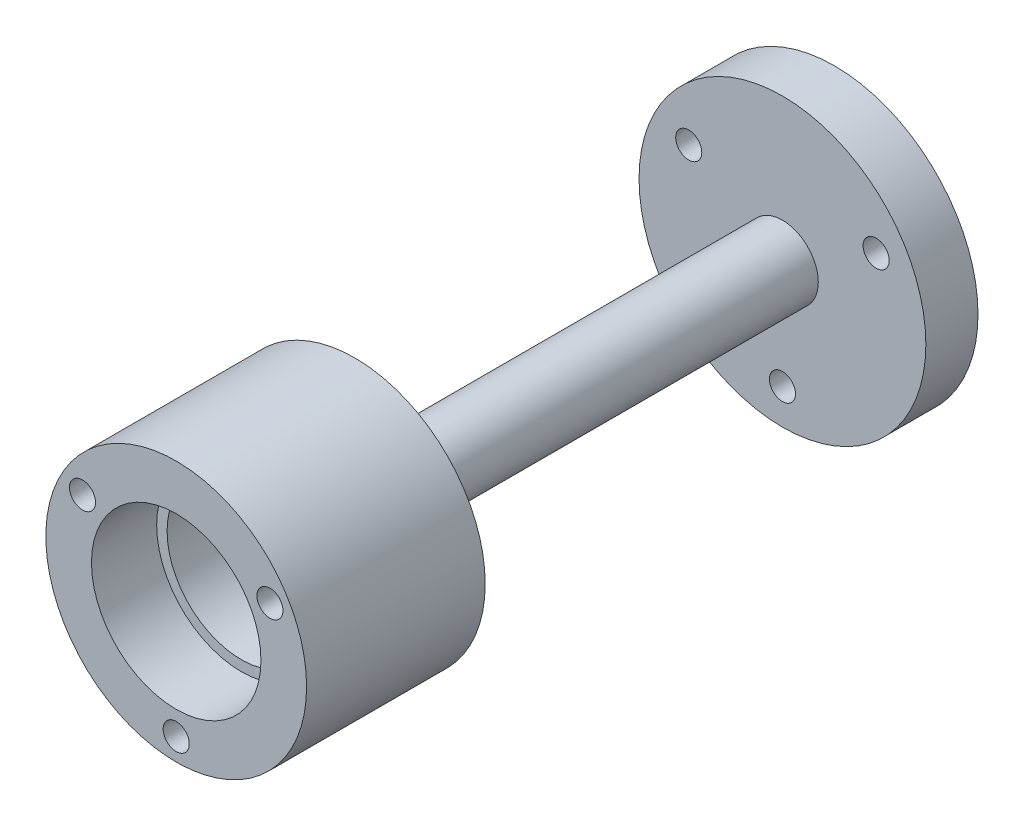
ISO-10303-21;
HEADER;
FILE_DESCRIPTION(('STEP AP214'),'2;1');
FILE_NAME('part.step','',(''),(''),'','','');
FILE_SCHEMA(('AUTOMOTIVE_DESIGN { 1 0 10303 214 1 1 1 1 }'));
ENDSEC;
DATA;
#1=APPLICATION_CONTEXT('core data for automotive mechanical design processes');
#2=APPLICATION_PROTOCOL_DEFINITION('international standard','automotive_design',2000,#1);
#3=PRODUCT_CONTEXT('',#1,'mechanical');
#4=PRODUCT('Part','Part','',(#3));
#5=PRODUCT_RELATED_PRODUCT_CATEGORY('part','',(#4));
#6=PRODUCT_DEFINITION_FORMATION('','',#4);
#7=PRODUCT_DEFINITION_CONTEXT('part definition',#1,'design');
#8=PRODUCT_DEFINITION('design','',#6,#7);
#9=PRODUCT_DEFINITION_SHAPE('','',#8);
#10=(LENGTH_UNIT() NAMED_UNIT(*) SI_UNIT(.MILLI.,.METRE.));
#11=(NAMED_UNIT(*) PLANE_ANGLE_UNIT() SI_UNIT($,.RADIAN.));
#12=(NAMED_UNIT(*) SI_UNIT($,.STERADIAN.) SOLID_ANGLE_UNIT());
#13=UNCERTAINTY_MEASURE_WITH_UNIT(LENGTH_MEASURE(1.E-05),#10,'distance_accuracy_value','');
#14=(GEOMETRIC_REPRESENTATION_CONTEXT(3) GLOBAL_UNCERTAINTY_ASSIGNED_CONTEXT((#13)) GLOBAL_UNIT_ASSIGNED_CONTEXT((#10,
#11,#12)) REPRESENTATION_CONTEXT('',''));
#15=CARTESIAN_POINT('',(0.,0.,0.));
#16=DIRECTION('',(0.,0.,1.));
#17=DIRECTION('',(1.,0.,0.));
#18=AXIS2_PLACEMENT_3D('',#15,#16,#17);
#19=CARTESIAN_POINT('',(0.,0.,32.81));
#20=DIRECTION('',(0.,0.,-1.));
#21=DIRECTION('',(-1.,0.,0.));
#22=AXIS2_PLACEMENT_3D('',#19,#20,#21);
#23=CYLINDRICAL_SURFACE('',#22,2.75);
#24=CARTESIAN_POINT('',(0.,0.,0.));
#25=DIRECTION('',(0.,0.,1.));
#26=DIRECTION('',(1.,0.,0.));
#27=AXIS2_PLACEMENT_3D('',#24,#25,#26);
#28=CIRCLE('',#27,2.75);
#29=CARTESIAN_POINT('',(2.75,0.,0.));
#30=VERTEX_POINT('',#29);
#31=EDGE_CURVE('E50',#30,#30,#28,.T.);
#32=ORIENTED_EDGE('',*,*,#31,.T.);
#33=EDGE_LOOP('',(#32));
#34=FACE_BOUND('',#33,.T.);
#35=CARTESIAN_POINT('',(0.,0.,32.8));
#36=DIRECTION('',(0.,0.,1.));
#37=DIRECTION('',(1.,0.,0.));
#38=AXIS2_PLACEMENT_3D('',#35,#36,#37);
#39=CIRCLE('',#38,2.75);
#40=CARTESIAN_POINT('',(2.75,0.,32.8));
#41=VERTEX_POINT('',#40);
#42=EDGE_CURVE('E10',#41,#41,#39,.T.);
#43=ORIENTED_EDGE('',*,*,#42,.F.);
#44=EDGE_LOOP('',(#43));
#45=FACE_BOUND('',#44,.T.);
#46=ADVANCED_FACE('F39',(#34,#45),#23,.T.);
#47=CARTESIAN_POINT('',(0.,0.,0.));
#48=DIRECTION('',(0.,0.,-1.));
#49=DIRECTION('',(-1.,0.,0.));
#50=AXIS2_PLACEMENT_3D('',#47,#48,#49);
#51=CYLINDRICAL_SURFACE('',#50,11.);
#52=CARTESIAN_POINT('',(0.,0.,0.));
#53=DIRECTION('',(0.,0.,1.));
#54=DIRECTION('',(1.,0.,0.));
#55=AXIS2_PLACEMENT_3D('',#52,#53,#54);
#56=CIRCLE('',#55,11.);
#57=CARTESIAN_POINT('',(11.,0.,0.));
#58=VERTEX_POINT('',#57);
#59=EDGE_CURVE('E52',#58,#58,#56,.T.);
#60=ORIENTED_EDGE('',*,*,#59,.F.);
#61=EDGE_LOOP('',(#60));
#62=FACE_BOUND('',#61,.T.);
#63=CARTESIAN_POINT('',(0.,0.,-4.));
#64=DIRECTION('',(0.,0.,1.));
#65=DIRECTION('',(1.,0.,0.));
#66=AXIS2_PLACEMENT_3D('',#63,#64,#65);
#67=CIRCLE('',#66,11.);
#68=CARTESIAN_POINT('',(11.,0.,-4.));
#69=VERTEX_POINT('',#68);
#70=EDGE_CURVE('E58',#69,#69,#67,.T.);
#71=ORIENTED_EDGE('',*,*,#70,.T.);
#72=EDGE_LOOP('',(#71));
#73=FACE_BOUND('',#72,.T.);
#74=ADVANCED_FACE('F41',(#62,#73),#51,.T.);
#75=CARTESIAN_POINT('',(0.,0.,0.));
#76=DIRECTION('',(0.,0.,1.));
#77=DIRECTION('',(1.,0.,0.));
#78=AXIS2_PLACEMENT_3D('',#75,#76,#77);
#79=PLANE('',#78);
#80=CARTESIAN_POINT('',(7.18801085141084,4.15,0.));
#81=DIRECTION('',(0.,0.,1.));
#82=DIRECTION('',(1.,0.,0.));
#83=AXIS2_PLACEMENT_3D('',#80,#81,#82);
#84=CIRCLE('',#83,1.);
#85=CARTESIAN_POINT('',(8.18801085141084,4.15,0.));
#86=VERTEX_POINT('',#85);
#87=EDGE_CURVE('E91',#86,#86,#84,.T.);
#88=ORIENTED_EDGE('',*,*,#87,.F.);
#89=EDGE_LOOP('',(#88));
#90=FACE_BOUND('',#89,.T.);
#91=CARTESIAN_POINT('',(-7.18801085141084,4.15,0.));
#92=DIRECTION('',(0.,0.,1.));
#93=DIRECTION('',(1.,0.,0.));
#94=AXIS2_PLACEMENT_3D('',#91,#92,#93);
#95=CIRCLE('',#94,1.);
#96=CARTESIAN_POINT('',(-6.18801085141084,4.15,0.));
#97=VERTEX_POINT('',#96);
#98=EDGE_CURVE('E105',#97,#97,#95,.T.);
#99=ORIENTED_EDGE('',*,*,#98,.F.);
#100=EDGE_LOOP('',(#99));
#101=FACE_BOUND('',#100,.T.);
#102=CARTESIAN_POINT('',(0.,-8.3,0.));
#103=DIRECTION('',(0.,0.,1.));
#104=DIRECTION('',(1.,0.,0.));
#105=AXIS2_PLACEMENT_3D('',#102,#103,#104);
#106=CIRCLE('',#105,1.);
#107=CARTESIAN_POINT('',(0.999999999999999,-8.3,0.));
#108=VERTEX_POINT('',#107);
#109=EDGE_CURVE('E106',#108,#108,#106,.T.);
#110=ORIENTED_EDGE('',*,*,#109,.F.);
#111=EDGE_LOOP('',(#110));
#112=FACE_BOUND('',#111,.T.);
#113=ORIENTED_EDGE('',*,*,#31,.F.);
#114=EDGE_LOOP('',(#113));
#115=FACE_BOUND('',#114,.T.);
#116=ORIENTED_EDGE('',*,*,#59,.T.);
#117=EDGE_LOOP('',(#116));
#118=FACE_BOUND('',#117,.T.);
#119=ADVANCED_FACE('F197',(#90,#101,#112,#115,#118),#79,.T.);
#120=CARTESIAN_POINT('',(0.,0.,-4.));
#121=DIRECTION('',(0.,0.,1.));
#122=DIRECTION('',(1.,0.,0.));
#123=AXIS2_PLACEMENT_3D('',#120,#121,#122);
#124=PLANE('',#123);
#125=CARTESIAN_POINT('',(7.18801085141084,4.15,-4.));
#126=DIRECTION('',(0.,0.,-1.));
#127=DIRECTION('',(-1.,0.,0.));
#128=AXIS2_PLACEMENT_3D('',#125,#126,#127);
#129=CIRCLE('',#128,1.);
#130=CARTESIAN_POINT('',(6.18801085141084,4.15,-4.));
#131=VERTEX_POINT('',#130);
#132=EDGE_CURVE('E109',#131,#131,#129,.T.);
#133=ORIENTED_EDGE('',*,*,#132,.F.);
#134=EDGE_LOOP('',(#133));
#135=FACE_BOUND('',#134,.T.);
#136=CARTESIAN_POINT('',(-7.18801085141084,4.15,-4.));
#137=DIRECTION('',(0.,0.,-1.));
#138=DIRECTION('',(-1.,0.,0.));
#139=AXIS2_PLACEMENT_3D('',#136,#137,#138);
#140=CIRCLE('',#139,1.);
#141=CARTESIAN_POINT('',(-8.18801085141084,4.15,-4.));
#142=VERTEX_POINT('',#141);
#143=EDGE_CURVE('E114',#142,#142,#140,.T.);
#144=ORIENTED_EDGE('',*,*,#143,.F.);
#145=EDGE_LOOP('',(#144));
#146=FACE_BOUND('',#145,.T.);
#147=CARTESIAN_POINT('',(0.,-8.3,-4.));
#148=DIRECTION('',(0.,0.,-1.));
#149=DIRECTION('',(-1.,0.,0.));
#150=AXIS2_PLACEMENT_3D('',#147,#148,#149);
#151=CIRCLE('',#150,1.);
#152=CARTESIAN_POINT('',(-1.,-8.3,-4.));
#153=VERTEX_POINT('',#152);
#154=EDGE_CURVE('E111',#153,#153,#151,.T.);
#155=ORIENTED_EDGE('',*,*,#154,.F.);
#156=EDGE_LOOP('',(#155));
#157=FACE_BOUND('',#156,.T.);
#158=ORIENTED_EDGE('',*,*,#70,.F.);
#159=EDGE_LOOP('',(#158));
#160=FACE_BOUND('',#159,.T.);
#161=ADVANCED_FACE('F207',(#135,#146,#157,#160),#124,.F.);
#162=CARTESIAN_POINT('',(0.,0.,35.));
#163=DIRECTION('',(0.,0.,-1.));
#164=DIRECTION('',(-1.,0.,0.));
#165=AXIS2_PLACEMENT_3D('',#162,#163,#164);
#166=CYLINDRICAL_SURFACE('',#165,10.);
#167=CARTESIAN_POINT('',(0.,0.,32.8));
#168=DIRECTION('',(0.,0.,1.));
#169=DIRECTION('',(1.,0.,0.));
#170=AXIS2_PLACEMENT_3D('',#167,#168,#169);
#171=CIRCLE('',#170,10.);
#172=CARTESIAN_POINT('',(10.,0.,32.8));
#173=VERTEX_POINT('',#172);
#174=EDGE_CURVE('E65',#173,#173,#171,.T.);
#175=ORIENTED_EDGE('',*,*,#174,.T.);
#176=EDGE_LOOP('',(#175));
#177=FACE_BOUND('',#176,.T.);
#178=CARTESIAN_POINT('',(0.,0.,46.5));
#179=DIRECTION('',(0.,0.,1.));
#180=DIRECTION('',(1.,0.,0.));
#181=AXIS2_PLACEMENT_3D('',#178,#179,#180);
#182=CIRCLE('',#181,10.);
#183=CARTESIAN_POINT('',(10.,0.,46.5));
#184=VERTEX_POINT('',#183);
#185=EDGE_CURVE('E82',#184,#184,#182,.T.);
#186=ORIENTED_EDGE('',*,*,#185,.F.);
#187=EDGE_LOOP('',(#186));
#188=FACE_BOUND('',#187,.T.);
#189=ADVANCED_FACE('F204',(#177,#188),#166,.T.);
#190=CARTESIAN_POINT('',(0.,0.,32.8));
#191=DIRECTION('',(0.,0.,1.));
#192=DIRECTION('',(1.,0.,0.));
#193=AXIS2_PLACEMENT_3D('',#190,#191,#192);
#194=PLANE('',#193);
#195=ORIENTED_EDGE('',*,*,#42,.T.);
#196=EDGE_LOOP('',(#195));
#197=FACE_BOUND('',#196,.T.);
#198=ORIENTED_EDGE('',*,*,#174,.F.);
#199=EDGE_LOOP('',(#198));
#200=FACE_BOUND('',#199,.T.);
#201=ADVANCED_FACE('F163',(#197,#200),#194,.F.);
#202=CARTESIAN_POINT('',(0.,0.,46.5));
#203=DIRECTION('',(0.,0.,1.));
#204=DIRECTION('',(1.,0.,0.));
#205=AXIS2_PLACEMENT_3D('',#202,#203,#204);
#206=PLANE('',#205);
#207=CARTESIAN_POINT('',(7.18801085141084,4.15,46.5));
#208=DIRECTION('',(0.,0.,1.));
#209=DIRECTION('',(1.,0.,0.));
#210=AXIS2_PLACEMENT_3D('',#207,#208,#209);
#211=CIRCLE('',#210,1.);
#212=CARTESIAN_POINT('',(8.18801085141084,4.15,46.5));
#213=VERTEX_POINT('',#212);
#214=EDGE_CURVE('E139',#213,#213,#211,.T.);
#215=ORIENTED_EDGE('',*,*,#214,.F.);
#216=EDGE_LOOP('',(#215));
#217=FACE_BOUND('',#216,.T.);
#218=CARTESIAN_POINT('',(-7.18801085141084,4.15,46.5));
#219=DIRECTION('',(0.,0.,1.));
#220=DIRECTION('',(1.,0.,0.));
#221=AXIS2_PLACEMENT_3D('',#218,#219,#220);
#222=CIRCLE('',#221,1.);
#223=CARTESIAN_POINT('',(-6.18801085141084,4.15,46.5));
#224=VERTEX_POINT('',#223);
#225=EDGE_CURVE('E134',#224,#224,#222,.T.);
#226=ORIENTED_EDGE('',*,*,#225,.F.);
#227=EDGE_LOOP('',(#226));
#228=FACE_BOUND('',#227,.T.);
#229=CARTESIAN_POINT('',(0.,-8.3,46.5));
#230=DIRECTION('',(0.,0.,1.));
#231=DIRECTION('',(1.,0.,0.));
#232=AXIS2_PLACEMENT_3D('',#229,#230,#231);
#233=CIRCLE('',#232,1.);
#234=CARTESIAN_POINT('',(0.999999999999999,-8.3,46.5));
#235=VERTEX_POINT('',#234);
#236=EDGE_CURVE('E126',#235,#235,#233,.T.);
#237=ORIENTED_EDGE('',*,*,#236,.F.);
#238=EDGE_LOOP('',(#237));
#239=FACE_BOUND('',#238,.T.);
#240=ORIENTED_EDGE('',*,*,#185,.T.);
#241=EDGE_LOOP('',(#240));
#242=FACE_BOUND('',#241,.T.);
#243=CARTESIAN_POINT('',(0.,0.,46.5));
#244=DIRECTION('',(0.,0.,1.));
#245=DIRECTION('',(1.,0.,0.));
#246=AXIS2_PLACEMENT_3D('',#243,#244,#245);
#247=CIRCLE('',#246,6.5);
#248=CARTESIAN_POINT('',(6.5,0.,46.5));
#249=VERTEX_POINT('',#248);
#250=EDGE_CURVE('E89',#249,#249,#247,.T.);
#251=ORIENTED_EDGE('',*,*,#250,.F.);
#252=EDGE_LOOP('',(#251));
#253=FACE_BOUND('',#252,.T.);
#254=ADVANCED_FACE('F160',(#217,#228,#239,#242,#253),#206,.T.);
#255=CARTESIAN_POINT('',(0.,0.,46.5));
#256=DIRECTION('',(0.,0.,-1.));
#257=DIRECTION('',(-1.,0.,0.));
#258=AXIS2_PLACEMENT_3D('',#255,#256,#257);
#259=CYLINDRICAL_SURFACE('',#258,6.5);
#260=ORIENTED_EDGE('',*,*,#250,.T.);
#261=EDGE_LOOP('',(#260));
#262=FACE_BOUND('',#261,.T.);
#263=CARTESIAN_POINT('',(0.,0.,41.5));
#264=DIRECTION('',(0.,0.,1.));
#265=DIRECTION('',(1.,0.,0.));
#266=AXIS2_PLACEMENT_3D('',#263,#264,#265);
#267=CIRCLE('',#266,6.5);
#268=CARTESIAN_POINT('',(6.5,0.,41.5));
#269=VERTEX_POINT('',#268);
#270=EDGE_CURVE('E92',#269,#269,#267,.T.);
#271=ORIENTED_EDGE('',*,*,#270,.F.);
#272=EDGE_LOOP('',(#271));
#273=FACE_BOUND('',#272,.T.);
#274=ADVANCED_FACE('F156',(#262,#273),#259,.F.);
#275=CARTESIAN_POINT('',(0.,0.,35.));
#276=DIRECTION('',(0.,0.,1.));
#277=DIRECTION('',(1.,0.,0.));
#278=AXIS2_PLACEMENT_3D('',#275,#276,#277);
#279=PLANE('',#278);
#280=CARTESIAN_POINT('',(0.,0.,35.));
#281=DIRECTION('',(0.,0.,1.));
#282=DIRECTION('',(1.,0.,0.));
#283=AXIS2_PLACEMENT_3D('',#280,#281,#282);
#284=CIRCLE('',#283,5.7);
#285=CARTESIAN_POINT('',(-5.7,0.,35.));
#286=VERTEX_POINT('',#285);
#287=EDGE_CURVE('E76',#286,#286,#284,.T.);
#288=ORIENTED_EDGE('',*,*,#287,.T.);
#289=EDGE_LOOP('',(#288));
#290=FACE_BOUND('',#289,.T.);
#291=ADVANCED_FACE('F173',(#290),#279,.T.);
#292=CARTESIAN_POINT('',(0.,0.,41.5));
#293=DIRECTION('',(0.,0.,-1.));
#294=DIRECTION('',(-1.,0.,0.));
#295=AXIS2_PLACEMENT_3D('',#292,#293,#294);
#296=CYLINDRICAL_SURFACE('',#295,5.7);
#297=CARTESIAN_POINT('',(0.,0.,41.5));
#298=DIRECTION('',(0.,0.,1.));
#299=DIRECTION('',(1.,0.,0.));
#300=AXIS2_PLACEMENT_3D('',#297,#298,#299);
#301=CIRCLE('',#300,5.7);
#302=CARTESIAN_POINT('',(-5.7,0.,41.5));
#303=VERTEX_POINT('',#302);
#304=EDGE_CURVE('E75',#303,#303,#301,.T.);
#305=CARTESIAN_POINT('',(-5.7,0.,41.5));
#306=CARTESIAN_POINT('',(-5.7,0.,41.4322916666667));
#307=CARTESIAN_POINT('',(-5.7,0.,41.3645833333333));
#308=CARTESIAN_POINT('',(-5.7,0.,41.2291666666667));
#309=CARTESIAN_POINT('',(-5.7,0.,41.1614583333333));
#310=CARTESIAN_POINT('',(-5.7,0.,41.0260416666667));
#311=CARTESIAN_POINT('',(-5.7,0.,40.9583333333333));
#312=CARTESIAN_POINT('',(-5.7,0.,40.8229166666667));
#313=CARTESIAN_POINT('',(-5.7,0.,40.7552083333333));
#314=CARTESIAN_POINT('',(-5.7,0.,40.6197916666667));
#315=CARTESIAN_POINT('',(-5.7,0.,40.5520833333333));
#316=CARTESIAN_POINT('',(-5.7,0.,40.4166666666667));
#317=CARTESIAN_POINT('',(-5.7,0.,40.3489583333333));
#318=CARTESIAN_POINT('',(-5.7,0.,40.2135416666667));
#319=CARTESIAN_POINT('',(-5.7,0.,40.1458333333333));
#320=CARTESIAN_POINT('',(-5.7,0.,40.0104166666667));
#321=CARTESIAN_POINT('',(-5.7,0.,39.9427083333333));
#322=CARTESIAN_POINT('',(-5.7,0.,39.8072916666667));
#323=CARTESIAN_POINT('',(-5.7,0.,39.7395833333333));
#324=CARTESIAN_POINT('',(-5.7,0.,39.6041666666667));
#325=CARTESIAN_POINT('',(-5.7,0.,39.5364583333333));
#326=CARTESIAN_POINT('',(-5.7,0.,39.4010416666667));
#327=CARTESIAN_POINT('',(-5.7,0.,39.3333333333333));
#328=CARTESIAN_POINT('',(-5.7,0.,39.1979166666667));
#329=CARTESIAN_POINT('',(-5.7,0.,39.1302083333333));
#330=CARTESIAN_POINT('',(-5.7,0.,38.9947916666667));
#331=CARTESIAN_POINT('',(-5.7,0.,38.9270833333333));
#332=CARTESIAN_POINT('',(-5.7,0.,38.7916666666667));
#333=CARTESIAN_POINT('',(-5.7,0.,38.7239583333333));
#334=CARTESIAN_POINT('',(-5.7,0.,38.5885416666667));
#335=CARTESIAN_POINT('',(-5.7,0.,38.5208333333333));
#336=CARTESIAN_POINT('',(-5.7,0.,38.3854166666667));
#337=CARTESIAN_POINT('',(-5.7,0.,38.3177083333333));
#338=CARTESIAN_POINT('',(-5.7,0.,38.1822916666667));
#339=CARTESIAN_POINT('',(-5.7,0.,38.1145833333333));
#340=CARTESIAN_POINT('',(-5.7,0.,37.9791666666667));
#341=CARTESIAN_POINT('',(-5.7,0.,37.9114583333333));
#342=CARTESIAN_POINT('',(-5.7,0.,37.7760416666667));
#343=CARTESIAN_POINT('',(-5.7,0.,37.7083333333333));
#344=CARTESIAN_POINT('',(-5.7,0.,37.5729166666667));
#345=CARTESIAN_POINT('',(-5.7,0.,37.5052083333333));
#346=CARTESIAN_POINT('',(-5.7,0.,37.3697916666667));
#347=CARTESIAN_POINT('',(-5.7,0.,37.3020833333333));
#348=CARTESIAN_POINT('',(-5.7,0.,37.1666666666667));
#349=CARTESIAN_POINT('',(-5.7,0.,37.0989583333333));
#350=CARTESIAN_POINT('',(-5.7,0.,36.9635416666667));
#351=CARTESIAN_POINT('',(-5.7,0.,36.8958333333333));
#352=CARTESIAN_POINT('',(-5.7,0.,36.7604166666667));
#353=CARTESIAN_POINT('',(-5.7,0.,36.6927083333333));
#354=CARTESIAN_POINT('',(-5.7,0.,36.5572916666667));
#355=CARTESIAN_POINT('',(-5.7,0.,36.4895833333333));
#356=CARTESIAN_POINT('',(-5.7,0.,36.3541666666667));
#357=CARTESIAN_POINT('',(-5.7,0.,36.2864583333333));
#358=CARTESIAN_POINT('',(-5.7,0.,36.1510416666667));
#359=CARTESIAN_POINT('',(-5.7,0.,36.0833333333333));
#360=CARTESIAN_POINT('',(-5.7,0.,35.9479166666667));
#361=CARTESIAN_POINT('',(-5.7,0.,35.8802083333333));
#362=CARTESIAN_POINT('',(-5.7,0.,35.7447916666667));
#363=CARTESIAN_POINT('',(-5.7,0.,35.6770833333333));
#364=CARTESIAN_POINT('',(-5.7,0.,35.5416666666667));
#365=CARTESIAN_POINT('',(-5.7,0.,35.4739583333333));
#366=CARTESIAN_POINT('',(-5.7,0.,35.3385416666667));
#367=CARTESIAN_POINT('',(-5.7,0.,35.2708333333333));
#368=CARTESIAN_POINT('',(-5.7,0.,35.1354166666667));
#369=CARTESIAN_POINT('',(-5.7,0.,35.0677083333333));
#370=CARTESIAN_POINT('',(-5.7,0.,35.));
#371=B_SPLINE_CURVE_WITH_KNOTS('',3,(#305,#306,#307,#308,#309,#310,#311,#312,#313,#314,#315,
#316,#317,#318,#319,#320,#321,#322,#323,#324,#325,#326,#327,#328,#329,#330,#331,#332,#333,#334,
#335,#336,#337,#338,#339,#340,#341,#342,#343,#344,#345,#346,#347,#348,#349,#350,#351,#352,#353,
#354,#355,#356,#357,#358,#359,#360,#361,#362,#363,#364,#365,#366,#367,#368,#369,#370),
.UNSPECIFIED.,.F.,.F.,(4,2,2,2,2,2,2,2,2,2,2,2,2,2,2,2,2,2,2,2,2,2,2,2,2,2,2,2,2,2,2,2,4),(0.,
0.203124999999998,0.406249999999997,0.609374999999995,0.812499999999994,1.015625,1.21875,
1.421875,1.62499999999999,1.828125,2.03125,2.234375,2.4375,2.64062499999999,2.84375,3.046875,
3.25,3.45312499999999,3.65625,3.859375,4.0625,4.26562499999999,4.46874999999999,4.671875,4.875,
5.078125,5.28124999999999,5.484375,5.6875,5.890625,6.09374999999999,6.29687499999999,6.5),.UNSPECIFIED.);
#372=EDGE_CURVE('BSEAM179',#303,#286,#371,.T.);
#373=ORIENTED_EDGE('',*,*,#304,.T.);
#374=ORIENTED_EDGE('',*,*,#287,.F.);
#375=ORIENTED_EDGE('',*,*,#372,.T.);
#376=ORIENTED_EDGE('',*,*,#372,.F.);
#377=EDGE_LOOP('',(#373,#375,#374,#376));
#378=FACE_BOUND('',#377,.T.);
#379=ADVANCED_FACE('F179',(#378),#296,.F.);
#380=CARTESIAN_POINT('',(0.,0.,41.5));
#381=DIRECTION('',(0.,0.,1.));
#382=DIRECTION('',(1.,0.,0.));
#383=AXIS2_PLACEMENT_3D('',#380,#381,#382);
#384=PLANE('',#383);
#385=ORIENTED_EDGE('',*,*,#304,.F.);
#386=EDGE_LOOP('',(#385));
#387=FACE_BOUND('',#386,.T.);
#388=ORIENTED_EDGE('',*,*,#270,.T.);
#389=EDGE_LOOP('',(#388));
#390=FACE_BOUND('',#389,.T.);
#391=ADVANCED_FACE('F180',(#387,#390),#384,.T.);
#392=CARTESIAN_POINT('',(0.,-8.3,0.00999999999999959));
#393=DIRECTION('',(0.,0.,-1.));
#394=DIRECTION('',(-1.,0.,0.));
#395=AXIS2_PLACEMENT_3D('',#392,#393,#394);
#396=CYLINDRICAL_SURFACE('',#395,1.);
#397=ORIENTED_EDGE('',*,*,#109,.T.);
#398=EDGE_LOOP('',(#397));
#399=FACE_BOUND('',#398,.T.);
#400=ORIENTED_EDGE('',*,*,#154,.T.);
#401=EDGE_LOOP('',(#400));
#402=FACE_BOUND('',#401,.T.);
#403=ADVANCED_FACE('F177',(#399,#402),#396,.F.);
#404=CARTESIAN_POINT('',(-7.18801085141084,4.15,0.00999999999999959));
#405=DIRECTION('',(0.,0.,-1.));
#406=DIRECTION('',(-1.,0.,0.));
#407=AXIS2_PLACEMENT_3D('',#404,#405,#406);
#408=CYLINDRICAL_SURFACE('',#407,1.);
#409=ORIENTED_EDGE('',*,*,#98,.T.);
#410=EDGE_LOOP('',(#409));
#411=FACE_BOUND('',#410,.T.);
#412=ORIENTED_EDGE('',*,*,#143,.T.);
#413=EDGE_LOOP('',(#412));
#414=FACE_BOUND('',#413,.T.);
#415=ADVANCED_FACE('F190',(#411,#414),#408,.F.);
#416=CARTESIAN_POINT('',(7.18801085141084,4.15,0.00999999999999959));
#417=DIRECTION('',(0.,0.,-1.));
#418=DIRECTION('',(-1.,0.,0.));
#419=AXIS2_PLACEMENT_3D('',#416,#417,#418);
#420=CYLINDRICAL_SURFACE('',#419,1.);
#421=ORIENTED_EDGE('',*,*,#87,.T.);
#422=EDGE_LOOP('',(#421));
#423=FACE_BOUND('',#422,.T.);
#424=ORIENTED_EDGE('',*,*,#132,.T.);
#425=EDGE_LOOP('',(#424));
#426=FACE_BOUND('',#425,.T.);
#427=ADVANCED_FACE('F225',(#423,#426),#420,.F.);
#428=CARTESIAN_POINT('',(0.,-8.3,42.2));
#429=DIRECTION('',(0.,0.,1.));
#430=DIRECTION('',(1.,0.,0.));
#431=AXIS2_PLACEMENT_3D('',#428,#429,#430);
#432=CYLINDRICAL_SURFACE('',#431,1.);
#433=CARTESIAN_POINT('',(0.,-8.3,42.2));
#434=DIRECTION('',(0.,0.,1.));
#435=DIRECTION('',(1.,0.,0.));
#436=AXIS2_PLACEMENT_3D('',#433,#434,#435);
#437=CIRCLE('',#436,1.);
#438=CARTESIAN_POINT('',(0.999999999999999,-8.3,42.2));
#439=VERTEX_POINT('',#438);
#440=EDGE_CURVE('E124',#439,#439,#437,.T.);
#441=CARTESIAN_POINT('',(0.999999999999999,-8.3,42.2));
#442=CARTESIAN_POINT('',(0.999999999999999,-8.3,42.2447916666667));
#443=CARTESIAN_POINT('',(0.999999999999999,-8.3,42.2895833333333));
#444=CARTESIAN_POINT('',(0.999999999999999,-8.3,42.3791666666667));
#445=CARTESIAN_POINT('',(0.999999999999999,-8.3,42.4239583333333));
#446=CARTESIAN_POINT('',(0.999999999999999,-8.3,42.5135416666667));
#447=CARTESIAN_POINT('',(0.999999999999999,-8.3,42.5583333333333));
#448=CARTESIAN_POINT('',(0.999999999999999,-8.3,42.6479166666667));
#449=CARTESIAN_POINT('',(0.999999999999999,-8.3,42.6927083333333));
#450=CARTESIAN_POINT('',(0.999999999999999,-8.3,42.7822916666667));
#451=CARTESIAN_POINT('',(0.999999999999999,-8.3,42.8270833333333));
#452=CARTESIAN_POINT('',(0.999999999999999,-8.3,42.9166666666667));
#453=CARTESIAN_POINT('',(0.999999999999999,-8.3,42.9614583333333));
#454=CARTESIAN_POINT('',(0.999999999999999,-8.3,43.0510416666667));
#455=CARTESIAN_POINT('',(0.999999999999999,-8.3,43.0958333333333));
#456=CARTESIAN_POINT('',(0.999999999999999,-8.3,43.1854166666667));
#457=CARTESIAN_POINT('',(0.999999999999999,-8.3,43.2302083333333));
#458=CARTESIAN_POINT('',(0.999999999999999,-8.3,43.3197916666667));
#459=CARTESIAN_POINT('',(0.999999999999999,-8.3,43.3645833333333));
#460=CARTESIAN_POINT('',(0.999999999999999,-8.3,43.4541666666667));
#461=CARTESIAN_POINT('',(0.999999999999999,-8.3,43.4989583333333));
#462=CARTESIAN_POINT('',(0.999999999999999,-8.3,43.5885416666667));
#463=CARTESIAN_POINT('',(0.999999999999999,-8.3,43.6333333333333));
#464=CARTESIAN_POINT('',(0.999999999999999,-8.3,43.7229166666667));
#465=CARTESIAN_POINT('',(0.999999999999999,-8.3,43.7677083333333));
#466=CARTESIAN_POINT('',(0.999999999999999,-8.3,43.8572916666667));
#467=CARTESIAN_POINT('',(0.999999999999999,-8.3,43.9020833333333));
#468=CARTESIAN_POINT('',(0.999999999999999,-8.3,43.9916666666667));
#469=CARTESIAN_POINT('',(0.999999999999999,-8.3,44.0364583333333));
#470=CARTESIAN_POINT('',(0.999999999999999,-8.3,44.1260416666667));
#471=CARTESIAN_POINT('',(0.999999999999999,-8.3,44.1708333333333));
#472=CARTESIAN_POINT('',(0.999999999999999,-8.3,44.2604166666667));
#473=CARTESIAN_POINT('',(0.999999999999999,-8.3,44.3052083333333));
#474=CARTESIAN_POINT('',(0.999999999999999,-8.3,44.3947916666667));
#475=CARTESIAN_POINT('',(0.999999999999999,-8.3,44.4395833333333));
#476=CARTESIAN_POINT('',(0.999999999999999,-8.3,44.5291666666667));
#477=CARTESIAN_POINT('',(0.999999999999999,-8.3,44.5739583333333));
#478=CARTESIAN_POINT('',(0.999999999999999,-8.3,44.6635416666667));
#479=CARTESIAN_POINT('',(0.999999999999999,-8.3,44.7083333333333));
#480=CARTESIAN_POINT('',(0.999999999999999,-8.3,44.7979166666667));
#481=CARTESIAN_POINT('',(0.999999999999999,-8.3,44.8427083333333));
#482=CARTESIAN_POINT('',(0.999999999999999,-8.3,44.9322916666667));
#483=CARTESIAN_POINT('',(0.999999999999999,-8.3,44.9770833333333));
#484=CARTESIAN_POINT('',(0.999999999999999,-8.3,45.0666666666667));
#485=CARTESIAN_POINT('',(0.999999999999999,-8.3,45.1114583333333));
#486=CARTESIAN_POINT('',(0.999999999999999,-8.3,45.2010416666667));
#487=CARTESIAN_POINT('',(0.999999999999999,-8.3,45.2458333333333));
#488=CARTESIAN_POINT('',(0.999999999999999,-8.3,45.3354166666667));
#489=CARTESIAN_POINT('',(0.999999999999999,-8.3,45.3802083333333));
#490=CARTESIAN_POINT('',(0.999999999999999,-8.3,45.4697916666667));
#491=CARTESIAN_POINT('',(0.999999999999999,-8.3,45.5145833333333));
#492=CARTESIAN_POINT('',(0.999999999999999,-8.3,45.6041666666667));
#493=CARTESIAN_POINT('',(0.999999999999999,-8.3,45.6489583333333));
#494=CARTESIAN_POINT('',(0.999999999999999,-8.3,45.7385416666667));
#495=CARTESIAN_POINT('',(0.999999999999999,-8.3,45.7833333333333));
#496=CARTESIAN_POINT('',(0.999999999999999,-8.3,45.8729166666667));
#497=CARTESIAN_POINT('',(0.999999999999999,-8.3,45.9177083333333));
#498=CARTESIAN_POINT('',(0.999999999999999,-8.3,46.0072916666667));
#499=CARTESIAN_POINT('',(0.999999999999999,-8.3,46.0520833333333));
#500=CARTESIAN_POINT('',(0.999999999999999,-8.3,46.1416666666667));
#501=CARTESIAN_POINT('',(0.999999999999999,-8.3,46.1864583333333));
#502=CARTESIAN_POINT('',(0.999999999999999,-8.3,46.2760416666667));
#503=CARTESIAN_POINT('',(0.999999999999999,-8.3,46.3208333333333));
#504=CARTESIAN_POINT('',(0.999999999999999,-8.3,46.4104166666667));
#505=CARTESIAN_POINT('',(0.999999999999999,-8.3,46.4552083333333));
#506=CARTESIAN_POINT('',(0.999999999999999,-8.3,46.5));
#507=B_SPLINE_CURVE_WITH_KNOTS('',3,(#441,#442,#443,#444,#445,#446,#447,#448,#449,#450,#451,
#452,#453,#454,#455,#456,#457,#458,#459,#460,#461,#462,#463,#464,#465,#466,#467,#468,#469,#470,
#471,#472,#473,#474,#475,#476,#477,#478,#479,#480,#481,#482,#483,#484,#485,#486,#487,#488,#489,
#490,#491,#492,#493,#494,#495,#496,#497,#498,#499,#500,#501,#502,#503,#504,#505,#506),
.UNSPECIFIED.,.F.,.F.,(4,2,2,2,2,2,2,2,2,2,2,2,2,2,2,2,2,2,2,2,2,2,2,2,2,2,2,2,2,2,2,2,4),(0.,
0.134375000000006,0.268750000000005,0.403125000000004,0.537500000000003,0.671875000000002,
0.806250000000001,0.940625,1.075,1.20937500000001,1.34375,1.478125,1.6125,1.746875,1.88125,
2.015625,2.15,2.28437500000001,2.41875,2.553125,2.6875,2.821875,2.95625,3.090625,3.225,3.359375,
3.49375,3.628125,3.7625,3.896875,4.03125,4.165625,4.3),.UNSPECIFIED.);
#508=EDGE_CURVE('BSEAM226',#439,#235,#507,.T.);
#509=ORIENTED_EDGE('',*,*,#440,.F.);
#510=ORIENTED_EDGE('',*,*,#236,.T.);
#511=ORIENTED_EDGE('',*,*,#508,.T.);
#512=ORIENTED_EDGE('',*,*,#508,.F.);
#513=EDGE_LOOP('',(#509,#511,#510,#512));
#514=FACE_BOUND('',#513,.T.);
#515=ADVANCED_FACE('F226',(#514),#432,.F.);
#516=CARTESIAN_POINT('',(0.,-8.3,42.2));
#517=DIRECTION('',(0.,0.,1.));
#518=DIRECTION('',(1.,0.,0.));
#519=AXIS2_PLACEMENT_3D('',#516,#517,#518);
#520=PLANE('',#519);
#521=ORIENTED_EDGE('',*,*,#440,.T.);
#522=EDGE_LOOP('',(#521));
#523=FACE_BOUND('',#522,.T.);
#524=ADVANCED_FACE('F235',(#523),#520,.T.);
#525=CARTESIAN_POINT('',(-7.18801085141084,4.15,42.2));
#526=DIRECTION('',(0.,0.,1.));
#527=DIRECTION('',(1.,0.,0.));
#528=AXIS2_PLACEMENT_3D('',#525,#526,#527);
#529=CYLINDRICAL_SURFACE('',#528,1.);
#530=CARTESIAN_POINT('',(-7.18801085141084,4.15,42.2));
#531=DIRECTION('',(0.,0.,1.));
#532=DIRECTION('',(1.,0.,0.));
#533=AXIS2_PLACEMENT_3D('',#530,#531,#532);
#534=CIRCLE('',#533,1.);
#535=CARTESIAN_POINT('',(-6.18801085141084,4.15,42.2));
#536=VERTEX_POINT('',#535);
#537=EDGE_CURVE('E131',#536,#536,#534,.T.);
#538=CARTESIAN_POINT('',(-6.18801085141084,4.15,42.2));
#539=CARTESIAN_POINT('',(-6.18801085141084,4.15,42.2447916666667));
#540=CARTESIAN_POINT('',(-6.18801085141084,4.15,42.2895833333333));
#541=CARTESIAN_POINT('',(-6.18801085141084,4.15,42.3791666666667));
#542=CARTESIAN_POINT('',(-6.18801085141084,4.15,42.4239583333333));
#543=CARTESIAN_POINT('',(-6.18801085141084,4.15,42.5135416666667));
#544=CARTESIAN_POINT('',(-6.18801085141084,4.15,42.5583333333333));
#545=CARTESIAN_POINT('',(-6.18801085141084,4.15,42.6479166666667));
#546=CARTESIAN_POINT('',(-6.18801085141084,4.15,42.6927083333333));
#547=CARTESIAN_POINT('',(-6.18801085141084,4.15,42.7822916666667));
#548=CARTESIAN_POINT('',(-6.18801085141084,4.15,42.8270833333333));
#549=CARTESIAN_POINT('',(-6.18801085141084,4.15,42.9166666666667));
#550=CARTESIAN_POINT('',(-6.18801085141084,4.15,42.9614583333333));
#551=CARTESIAN_POINT('',(-6.18801085141084,4.15,43.0510416666667));
#552=CARTESIAN_POINT('',(-6.18801085141084,4.15,43.0958333333333));
#553=CARTESIAN_POINT('',(-6.18801085141084,4.15,43.1854166666667));
#554=CARTESIAN_POINT('',(-6.18801085141084,4.15,43.2302083333333));
#555=CARTESIAN_POINT('',(-6.18801085141084,4.15,43.3197916666667));
#556=CARTESIAN_POINT('',(-6.18801085141084,4.15,43.3645833333333));
#557=CARTESIAN_POINT('',(-6.18801085141084,4.15,43.4541666666667));
#558=CARTESIAN_POINT('',(-6.18801085141084,4.15,43.4989583333333));
#559=CARTESIAN_POINT('',(-6.18801085141084,4.15,43.5885416666667));
#560=CARTESIAN_POINT('',(-6.18801085141084,4.15,43.6333333333333));
#561=CARTESIAN_POINT('',(-6.18801085141084,4.15,43.7229166666667));
#562=CARTESIAN_POINT('',(-6.18801085141084,4.15,43.7677083333333));
#563=CARTESIAN_POINT('',(-6.18801085141084,4.15,43.8572916666667));
#564=CARTESIAN_POINT('',(-6.18801085141084,4.15,43.9020833333333));
#565=CARTESIAN_POINT('',(-6.18801085141084,4.15,43.9916666666667));
#566=CARTESIAN_POINT('',(-6.18801085141084,4.15,44.0364583333333));
#567=CARTESIAN_POINT('',(-6.18801085141084,4.15,44.1260416666667));
#568=CARTESIAN_POINT('',(-6.18801085141084,4.15,44.1708333333333));
#569=CARTESIAN_POINT('',(-6.18801085141084,4.15,44.2604166666667));
#570=CARTESIAN_POINT('',(-6.18801085141084,4.15,44.3052083333333));
#571=CARTESIAN_POINT('',(-6.18801085141084,4.15,44.3947916666667));
#572=CARTESIAN_POINT('',(-6.18801085141084,4.15,44.4395833333333));
#573=CARTESIAN_POINT('',(-6.18801085141084,4.15,44.5291666666667));
#574=CARTESIAN_POINT('',(-6.18801085141084,4.15,44.5739583333333));
#575=CARTESIAN_POINT('',(-6.18801085141084,4.15,44.6635416666667));
#576=CARTESIAN_POINT('',(-6.18801085141084,4.15,44.7083333333333));
#577=CARTESIAN_POINT('',(-6.18801085141084,4.15,44.7979166666667));
#578=CARTESIAN_POINT('',(-6.18801085141084,4.15,44.8427083333333));
#579=CARTESIAN_POINT('',(-6.18801085141084,4.15,44.9322916666667));
#580=CARTESIAN_POINT('',(-6.18801085141084,4.15,44.9770833333333));
#581=CARTESIAN_POINT('',(-6.18801085141084,4.15,45.0666666666667));
#582=CARTESIAN_POINT('',(-6.18801085141084,4.15,45.1114583333333));
#583=CARTESIAN_POINT('',(-6.18801085141084,4.15,45.2010416666667));
#584=CARTESIAN_POINT('',(-6.18801085141084,4.15,45.2458333333333));
#585=CARTESIAN_POINT('',(-6.18801085141084,4.15,45.3354166666667));
#586=CARTESIAN_POINT('',(-6.18801085141084,4.15,45.3802083333333));
#587=CARTESIAN_POINT('',(-6.18801085141084,4.15,45.4697916666667));
#588=CARTESIAN_POINT('',(-6.18801085141084,4.15,45.5145833333333));
#589=CARTESIAN_POINT('',(-6.18801085141084,4.15,45.6041666666667));
#590=CARTESIAN_POINT('',(-6.18801085141084,4.15,45.6489583333333));
#591=CARTESIAN_POINT('',(-6.18801085141084,4.15,45.7385416666667));
#592=CARTESIAN_POINT('',(-6.18801085141084,4.15,45.7833333333333));
#593=CARTESIAN_POINT('',(-6.18801085141084,4.15,45.8729166666667));
#594=CARTESIAN_POINT('',(-6.18801085141084,4.15,45.9177083333333));
#595=CARTESIAN_POINT('',(-6.18801085141084,4.15,46.0072916666667));
#596=CARTESIAN_POINT('',(-6.18801085141084,4.15,46.0520833333333));
#597=CARTESIAN_POINT('',(-6.18801085141084,4.15,46.1416666666667));
#598=CARTESIAN_POINT('',(-6.18801085141084,4.15,46.1864583333333));
#599=CARTESIAN_POINT('',(-6.18801085141084,4.15,46.2760416666667));
#600=CARTESIAN_POINT('',(-6.18801085141084,4.15,46.3208333333333));
#601=CARTESIAN_POINT('',(-6.18801085141084,4.15,46.4104166666667));
#602=CARTESIAN_POINT('',(-6.18801085141084,4.15,46.4552083333333));
#603=CARTESIAN_POINT('',(-6.18801085141084,4.15,46.5));
#604=B_SPLINE_CURVE_WITH_KNOTS('',3,(#538,#539,#540,#541,#542,#543,#544,#545,#546,#547,#548,
#549,#550,#551,#552,#553,#554,#555,#556,#557,#558,#559,#560,#561,#562,#563,#564,#565,#566,#567,
#568,#569,#570,#571,#572,#573,#574,#575,#576,#577,#578,#579,#580,#581,#582,#583,#584,#585,#586,
#587,#588,#589,#590,#591,#592,#593,#594,#595,#596,#597,#598,#599,#600,#601,#602,#603),
.UNSPECIFIED.,.F.,.F.,(4,2,2,2,2,2,2,2,2,2,2,2,2,2,2,2,2,2,2,2,2,2,2,2,2,2,2,2,2,2,2,2,4),(0.,
0.134375000000006,0.268750000000005,0.403125000000004,0.537500000000003,0.671875000000002,
0.806250000000001,0.940625,1.075,1.20937500000001,1.34375,1.478125,1.6125,1.746875,1.88125,
2.015625,2.15,2.28437500000001,2.41875,2.553125,2.6875,2.821875,2.95625,3.090625,3.225,3.359375,
3.49375,3.628125,3.7625,3.896875,4.03125,4.165625,4.3),.UNSPECIFIED.);
#605=EDGE_CURVE('BSEAM232',#536,#224,#604,.T.);
#606=ORIENTED_EDGE('',*,*,#537,.F.);
#607=ORIENTED_EDGE('',*,*,#225,.T.);
#608=ORIENTED_EDGE('',*,*,#605,.T.);
#609=ORIENTED_EDGE('',*,*,#605,.F.);
#610=EDGE_LOOP('',(#606,#608,#607,#609));
#611=FACE_BOUND('',#610,.T.);
#612=ADVANCED_FACE('F232',(#611),#529,.F.);
#613=CARTESIAN_POINT('',(-7.18801085141084,4.15,42.2));
#614=DIRECTION('',(0.,0.,1.));
#615=DIRECTION('',(1.,0.,0.));
#616=AXIS2_PLACEMENT_3D('',#613,#614,#615);
#617=PLANE('',#616);
#618=ORIENTED_EDGE('',*,*,#537,.T.);
#619=EDGE_LOOP('',(#618));
#620=FACE_BOUND('',#619,.T.);
#621=ADVANCED_FACE('F153',(#620),#617,.T.);
#622=CARTESIAN_POINT('',(7.18801085141084,4.15,42.2));
#623=DIRECTION('',(0.,0.,1.));
#624=DIRECTION('',(1.,0.,0.));
#625=AXIS2_PLACEMENT_3D('',#622,#623,#624);
#626=CYLINDRICAL_SURFACE('',#625,1.);
#627=CARTESIAN_POINT('',(7.18801085141084,4.15,42.2));
#628=DIRECTION('',(0.,0.,1.));
#629=DIRECTION('',(1.,0.,0.));
#630=AXIS2_PLACEMENT_3D('',#627,#628,#629);
#631=CIRCLE('',#630,1.);
#632=CARTESIAN_POINT('',(8.18801085141084,4.15,42.2));
#633=VERTEX_POINT('',#632);
#634=EDGE_CURVE('E116',#633,#633,#631,.T.);
#635=CARTESIAN_POINT('',(8.18801085141084,4.15,42.2));
#636=CARTESIAN_POINT('',(8.18801085141084,4.15,42.2447916666667));
#637=CARTESIAN_POINT('',(8.18801085141084,4.15,42.2895833333333));
#638=CARTESIAN_POINT('',(8.18801085141084,4.15,42.3791666666667));
#639=CARTESIAN_POINT('',(8.18801085141084,4.15,42.4239583333333));
#640=CARTESIAN_POINT('',(8.18801085141084,4.15,42.5135416666667));
#641=CARTESIAN_POINT('',(8.18801085141084,4.15,42.5583333333333));
#642=CARTESIAN_POINT('',(8.18801085141084,4.15,42.6479166666667));
#643=CARTESIAN_POINT('',(8.18801085141084,4.15,42.6927083333333));
#644=CARTESIAN_POINT('',(8.18801085141084,4.15,42.7822916666667));
#645=CARTESIAN_POINT('',(8.18801085141084,4.15,42.8270833333333));
#646=CARTESIAN_POINT('',(8.18801085141084,4.15,42.9166666666667));
#647=CARTESIAN_POINT('',(8.18801085141084,4.15,42.9614583333333));
#648=CARTESIAN_POINT('',(8.18801085141084,4.15,43.0510416666667));
#649=CARTESIAN_POINT('',(8.18801085141084,4.15,43.0958333333333));
#650=CARTESIAN_POINT('',(8.18801085141084,4.15,43.1854166666667));
#651=CARTESIAN_POINT('',(8.18801085141084,4.15,43.2302083333333));
#652=CARTESIAN_POINT('',(8.18801085141084,4.15,43.3197916666667));
#653=CARTESIAN_POINT('',(8.18801085141084,4.15,43.3645833333333));
#654=CARTESIAN_POINT('',(8.18801085141084,4.15,43.4541666666667));
#655=CARTESIAN_POINT('',(8.18801085141084,4.15,43.4989583333333));
#656=CARTESIAN_POINT('',(8.18801085141084,4.15,43.5885416666667));
#657=CARTESIAN_POINT('',(8.18801085141084,4.15,43.6333333333333));
#658=CARTESIAN_POINT('',(8.18801085141084,4.15,43.7229166666667));
#659=CARTESIAN_POINT('',(8.18801085141084,4.15,43.7677083333333));
#660=CARTESIAN_POINT('',(8.18801085141084,4.15,43.8572916666667));
#661=CARTESIAN_POINT('',(8.18801085141084,4.15,43.9020833333333));
#662=CARTESIAN_POINT('',(8.18801085141084,4.15,43.9916666666667));
#663=CARTESIAN_POINT('',(8.18801085141084,4.15,44.0364583333333));
#664=CARTESIAN_POINT('',(8.18801085141084,4.15,44.1260416666667));
#665=CARTESIAN_POINT('',(8.18801085141084,4.15,44.1708333333333));
#666=CARTESIAN_POINT('',(8.18801085141084,4.15,44.2604166666667));
#667=CARTESIAN_POINT('',(8.18801085141084,4.15,44.3052083333333));
#668=CARTESIAN_POINT('',(8.18801085141084,4.15,44.3947916666667));
#669=CARTESIAN_POINT('',(8.18801085141084,4.15,44.4395833333333));
#670=CARTESIAN_POINT('',(8.18801085141084,4.15,44.5291666666667));
#671=CARTESIAN_POINT('',(8.18801085141084,4.15,44.5739583333333));
#672=CARTESIAN_POINT('',(8.18801085141084,4.15,44.6635416666667));
#673=CARTESIAN_POINT('',(8.18801085141084,4.15,44.7083333333333));
#674=CARTESIAN_POINT('',(8.18801085141084,4.15,44.7979166666667));
#675=CARTESIAN_POINT('',(8.18801085141084,4.15,44.8427083333333));
#676=CARTESIAN_POINT('',(8.18801085141084,4.15,44.9322916666667));
#677=CARTESIAN_POINT('',(8.18801085141084,4.15,44.9770833333333));
#678=CARTESIAN_POINT('',(8.18801085141084,4.15,45.0666666666667));
#679=CARTESIAN_POINT('',(8.18801085141084,4.15,45.1114583333333));
#680=CARTESIAN_POINT('',(8.18801085141084,4.15,45.2010416666667));
#681=CARTESIAN_POINT('',(8.18801085141084,4.15,45.2458333333333));
#682=CARTESIAN_POINT('',(8.18801085141084,4.15,45.3354166666667));
#683=CARTESIAN_POINT('',(8.18801085141084,4.15,45.3802083333333));
#684=CARTESIAN_POINT('',(8.18801085141084,4.15,45.4697916666667));
#685=CARTESIAN_POINT('',(8.18801085141084,4.15,45.5145833333333));
#686=CARTESIAN_POINT('',(8.18801085141084,4.15,45.6041666666667));
#687=CARTESIAN_POINT('',(8.18801085141084,4.15,45.6489583333333));
#688=CARTESIAN_POINT('',(8.18801085141084,4.15,45.7385416666667));
#689=CARTESIAN_POINT('',(8.18801085141084,4.15,45.7833333333333));
#690=CARTESIAN_POINT('',(8.18801085141084,4.15,45.8729166666667));
#691=CARTESIAN_POINT('',(8.18801085141084,4.15,45.9177083333333));
#692=CARTESIAN_POINT('',(8.18801085141084,4.15,46.0072916666667));
#693=CARTESIAN_POINT('',(8.18801085141084,4.15,46.0520833333333));
#694=CARTESIAN_POINT('',(8.18801085141084,4.15,46.1416666666667));
#695=CARTESIAN_POINT('',(8.18801085141084,4.15,46.1864583333333));
#696=CARTESIAN_POINT('',(8.18801085141084,4.15,46.2760416666667));
#697=CARTESIAN_POINT('',(8.18801085141084,4.15,46.3208333333333));
#698=CARTESIAN_POINT('',(8.18801085141084,4.15,46.4104166666667));
#699=CARTESIAN_POINT('',(8.18801085141084,4.15,46.4552083333333));
#700=CARTESIAN_POINT('',(8.18801085141084,4.15,46.5));
#701=B_SPLINE_CURVE_WITH_KNOTS('',3,(#635,#636,#637,#638,#639,#640,#641,#642,#643,#644,#645,
#646,#647,#648,#649,#650,#651,#652,#653,#654,#655,#656,#657,#658,#659,#660,#661,#662,#663,#664,
#665,#666,#667,#668,#669,#670,#671,#672,#673,#674,#675,#676,#677,#678,#679,#680,#681,#682,#683,
#684,#685,#686,#687,#688,#689,#690,#691,#692,#693,#694,#695,#696,#697,#698,#699,#700),
.UNSPECIFIED.,.F.,.F.,(4,2,2,2,2,2,2,2,2,2,2,2,2,2,2,2,2,2,2,2,2,2,2,2,2,2,2,2,2,2,2,2,4),(0.,
0.134375000000006,0.268750000000005,0.403125000000004,0.537500000000003,0.671875000000002,
0.806250000000001,0.940625,1.075,1.20937500000001,1.34375,1.478125,1.6125,1.746875,1.88125,
2.015625,2.15,2.28437500000001,2.41875,2.553125,2.6875,2.821875,2.95625,3.090625,3.225,3.359375,
3.49375,3.628125,3.7625,3.896875,4.03125,4.165625,4.3),.UNSPECIFIED.);
#702=EDGE_CURVE('BSEAM147',#633,#213,#701,.T.);
#703=ORIENTED_EDGE('',*,*,#634,.F.);
#704=ORIENTED_EDGE('',*,*,#214,.T.);
#705=ORIENTED_EDGE('',*,*,#702,.T.);
#706=ORIENTED_EDGE('',*,*,#702,.F.);
#707=EDGE_LOOP('',(#703,#705,#704,#706));
#708=FACE_BOUND('',#707,.T.);
#709=ADVANCED_FACE('F147',(#708),#626,.F.);
#710=CARTESIAN_POINT('',(7.18801085141084,4.15,42.2));
#711=DIRECTION('',(0.,0.,1.));
#712=DIRECTION('',(1.,0.,0.));
#713=AXIS2_PLACEMENT_3D('',#710,#711,#712);
#714=PLANE('',#713);
#715=ORIENTED_EDGE('',*,*,#634,.T.);
#716=EDGE_LOOP('',(#715));
#717=FACE_BOUND('',#716,.T.);
#718=ADVANCED_FACE('F150',(#717),#714,.T.);
#719=CLOSED_SHELL('',(#46,#74,#119,#161,#189,#201,#254,#274,#291,#379,#391,#403,#415,#427,#515,
#524,#612,#621,#709,#718));
#720=MANIFOLD_SOLID_BREP('B2',#719);
#721=ADVANCED_BREP_SHAPE_REPRESENTATION('',(#18,#720),#14);
#722=SHAPE_DEFINITION_REPRESENTATION(#9,#721);
ENDSEC;
END-ISO-10303-21;
